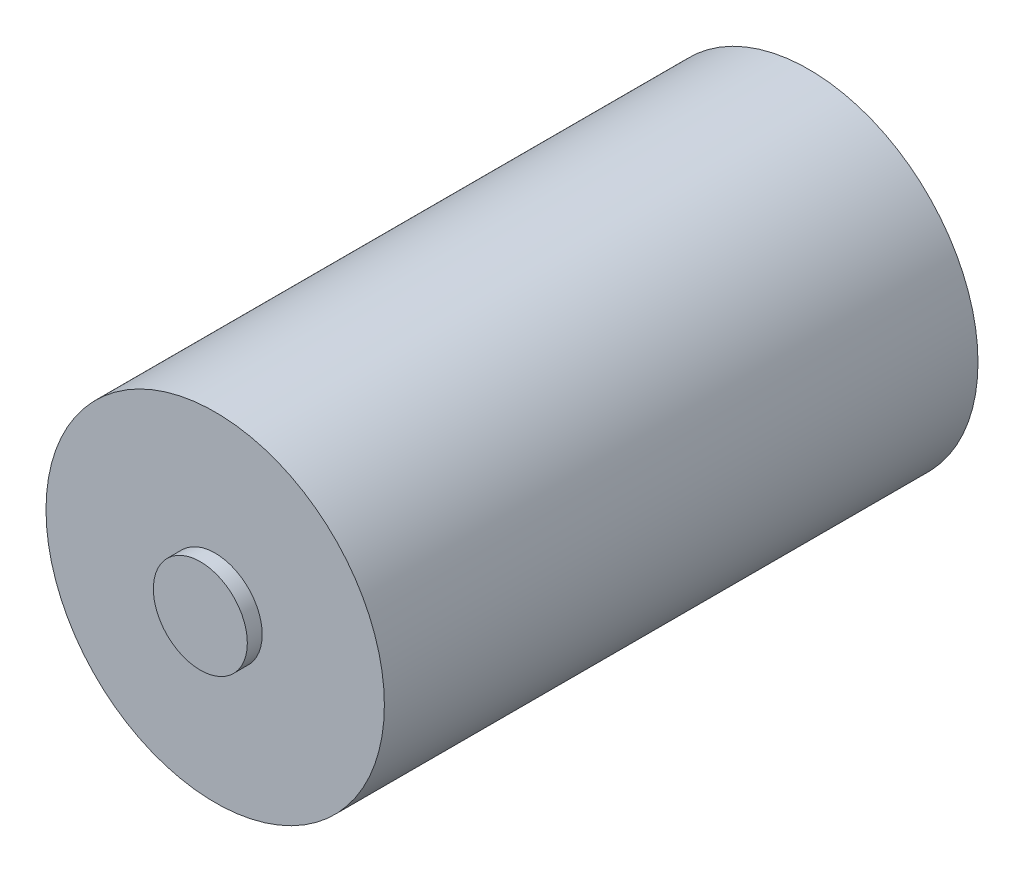
ISO-10303-21;
HEADER;
FILE_DESCRIPTION(('STEP AP214'),'2;1');
FILE_NAME('part.step','',(''),(''),'','','');
FILE_SCHEMA(('AUTOMOTIVE_DESIGN { 1 0 10303 214 1 1 1 1 }'));
ENDSEC;
DATA;
#1=APPLICATION_CONTEXT('core data for automotive mechanical design processes');
#2=APPLICATION_PROTOCOL_DEFINITION('international standard','automotive_design',2000,#1);
#3=PRODUCT_CONTEXT('',#1,'mechanical');
#4=PRODUCT('Part','Part','',(#3));
#5=PRODUCT_RELATED_PRODUCT_CATEGORY('part','',(#4));
#6=PRODUCT_DEFINITION_FORMATION('','',#4);
#7=PRODUCT_DEFINITION_CONTEXT('part definition',#1,'design');
#8=PRODUCT_DEFINITION('design','',#6,#7);
#9=PRODUCT_DEFINITION_SHAPE('','',#8);
#10=(LENGTH_UNIT() NAMED_UNIT(*) SI_UNIT(.MILLI.,.METRE.));
#11=(NAMED_UNIT(*) PLANE_ANGLE_UNIT() SI_UNIT($,.RADIAN.));
#12=(NAMED_UNIT(*) SI_UNIT($,.STERADIAN.) SOLID_ANGLE_UNIT());
#13=UNCERTAINTY_MEASURE_WITH_UNIT(LENGTH_MEASURE(1.E-05),#10,'distance_accuracy_value','');
#14=(GEOMETRIC_REPRESENTATION_CONTEXT(3) GLOBAL_UNCERTAINTY_ASSIGNED_CONTEXT((#13)) GLOBAL_UNIT_ASSIGNED_CONTEXT((#10,
#11,#12)) REPRESENTATION_CONTEXT('',''));
#15=CARTESIAN_POINT('',(0.,0.,0.));
#16=DIRECTION('',(0.,0.,1.));
#17=DIRECTION('',(1.,0.,0.));
#18=AXIS2_PLACEMENT_3D('',#15,#16,#17);
#19=CARTESIAN_POINT('',(0.,0.,61.5));
#20=DIRECTION('',(0.,0.,-1.));
#21=DIRECTION('',(-1.,0.,0.));
#22=AXIS2_PLACEMENT_3D('',#19,#20,#21);
#23=CYLINDRICAL_SURFACE('',#22,17.1);
#24=CARTESIAN_POINT('',(0.,0.,57.2158222345027));
#25=DIRECTION('',(0.,0.,-1.));
#26=DIRECTION('',(0.141506846168422,-0.98993727704712,0.));
#27=AXIS2_PLACEMENT_3D('',#24,#25,#26);
#28=CIRCLE('',#27,17.1);
#29=CARTESIAN_POINT('',(3.80024512058272,-16.6723764659837,57.2158222345027));
#30=VERTEX_POINT('',#29);
#31=CARTESIAN_POINT('',(2.41976706948002,-16.9279274375058,57.2158222345027));
#32=VERTEX_POINT('',#31);
#33=EDGE_CURVE('E177',#30,#32,#28,.T.);
#34=ORIENTED_EDGE('',*,*,#33,.F.);
#35=DIRECTION('',(0.,0.,1.));
#36=VECTOR('',#35,1.);
#37=CARTESIAN_POINT('',(3.80024512058272,-16.6723764659837,57.2158222345027));
#38=LINE('',#37,#36);
#39=CARTESIAN_POINT('',(3.80024512058272,-16.6723764659837,58.6201491575797));
#40=VERTEX_POINT('',#39);
#41=EDGE_CURVE('E213',#30,#40,#38,.T.);
#42=ORIENTED_EDGE('',*,*,#41,.T.);
#43=CARTESIAN_POINT('',(0.,0.,58.6201491575797));
#44=DIRECTION('',(0.,0.,-1.));
#45=DIRECTION('',(0.222236556759223,-0.974992775788521,0.));
#46=AXIS2_PLACEMENT_3D('',#43,#44,#45);
#47=CIRCLE('',#46,17.1);
#48=CARTESIAN_POINT('',(4.2157304152835,-16.5721940932893,58.6201491575797));
#49=VERTEX_POINT('',#48);
#50=EDGE_CURVE('E209',#49,#40,#47,.T.);
#51=ORIENTED_EDGE('',*,*,#50,.F.);
#52=DIRECTION('',(0.,0.,-1.));
#53=VECTOR('',#52,1.);
#54=CARTESIAN_POINT('',(4.2157304152835,-16.5721940932893,58.6201491575797));
#55=LINE('',#54,#53);
#56=CARTESIAN_POINT('',(4.2157304152835,-16.5721940932893,57.2158222345027));
#57=VERTEX_POINT('',#56);
#58=EDGE_CURVE('E206',#49,#57,#55,.T.);
#59=ORIENTED_EDGE('',*,*,#58,.T.);
#60=CARTESIAN_POINT('',(0.,0.,57.2158222345027));
#61=DIRECTION('',(0.,0.,-1.));
#62=DIRECTION('',(0.24653394241424,-0.9691341575023,0.));
#63=AXIS2_PLACEMENT_3D('',#60,#61,#62);
#64=CIRCLE('',#63,17.1);
#65=CARTESIAN_POINT('',(5.56097395635696,-16.1705154109793,57.2158222345027));
#66=VERTEX_POINT('',#65);
#67=EDGE_CURVE('E202',#66,#57,#64,.T.);
#68=ORIENTED_EDGE('',*,*,#67,.F.);
#69=DIRECTION('',(0.,0.,-1.));
#70=VECTOR('',#69,1.);
#71=CARTESIAN_POINT('',(5.56097395635696,-16.1705154109793,57.2158222345027));
#72=LINE('',#71,#70);
#73=CARTESIAN_POINT('',(5.56097395635696,-16.1705154109793,56.7884183883489));
#74=VERTEX_POINT('',#73);
#75=EDGE_CURVE('E199',#66,#74,#72,.T.);
#76=ORIENTED_EDGE('',*,*,#75,.T.);
#77=CARTESIAN_POINT('',(0.,0.,56.7884183883489));
#78=DIRECTION('',(0.,0.,-1.));
#79=DIRECTION('',(0.24653394241424,-0.9691341575023,0.));
#80=AXIS2_PLACEMENT_3D('',#77,#78,#79);
#81=CIRCLE('',#80,17.1);
#82=CARTESIAN_POINT('',(4.2157304152835,-16.5721940932893,56.7884183883489));
#83=VERTEX_POINT('',#82);
#84=EDGE_CURVE('E196',#74,#83,#81,.T.);
#85=ORIENTED_EDGE('',*,*,#84,.T.);
#86=DIRECTION('',(0.,0.,-1.));
#87=VECTOR('',#86,1.);
#88=CARTESIAN_POINT('',(4.2157304152835,-16.5721940932893,56.7884183883489));
#89=LINE('',#88,#87);
#90=CARTESIAN_POINT('',(4.2157304152835,-16.5721940932893,55.384091465272));
#91=VERTEX_POINT('',#90);
#92=EDGE_CURVE('E193',#83,#91,#89,.T.);
#93=ORIENTED_EDGE('',*,*,#92,.T.);
#94=CARTESIAN_POINT('',(0.,0.,55.384091465272));
#95=DIRECTION('',(0.,0.,-1.));
#96=DIRECTION('',(0.222236556759223,-0.974992775788521,0.));
#97=AXIS2_PLACEMENT_3D('',#94,#95,#96);
#98=CIRCLE('',#97,17.1);
#99=CARTESIAN_POINT('',(3.80024512058272,-16.6723764659837,55.384091465272));
#100=VERTEX_POINT('',#99);
#101=EDGE_CURVE('E190',#91,#100,#98,.T.);
#102=ORIENTED_EDGE('',*,*,#101,.T.);
#103=DIRECTION('',(0.,0.,1.));
#104=VECTOR('',#103,1.);
#105=CARTESIAN_POINT('',(3.80024512058272,-16.6723764659837,55.384091465272));
#106=LINE('',#105,#104);
#107=CARTESIAN_POINT('',(3.80024512058273,-16.6723764659837,56.7884183883489));
#108=VERTEX_POINT('',#107);
#109=EDGE_CURVE('E171',#100,#108,#106,.T.);
#110=ORIENTED_EDGE('',*,*,#109,.T.);
#111=CARTESIAN_POINT('',(0.,0.,56.7884183883489));
#112=DIRECTION('',(0.,0.,-1.));
#113=DIRECTION('',(0.141506846168422,-0.98993727704712,0.));
#114=AXIS2_PLACEMENT_3D('',#111,#112,#113);
#115=CIRCLE('',#114,17.1);
#116=CARTESIAN_POINT('',(2.41976706948002,-16.9279274375058,56.7884183883489));
#117=VERTEX_POINT('',#116);
#118=EDGE_CURVE('E166',#108,#117,#115,.T.);
#119=ORIENTED_EDGE('',*,*,#118,.T.);
#120=DIRECTION('',(0.,0.,1.));
#121=VECTOR('',#120,1.);
#122=CARTESIAN_POINT('',(2.41976706948002,-16.9279274375058,56.7884183883489));
#123=LINE('',#122,#121);
#124=EDGE_CURVE('E169',#117,#32,#123,.T.);
#125=ORIENTED_EDGE('',*,*,#124,.T.);
#126=EDGE_LOOP('',(#34,#42,#51,#59,#68,#76,#85,#93,#102,#110,#119,#125));
#127=FACE_BOUND('',#126,.T.);
#128=CARTESIAN_POINT('',(0.,0.,0.));
#129=DIRECTION('',(0.,0.,1.));
#130=DIRECTION('',(1.,0.,0.));
#131=AXIS2_PLACEMENT_3D('',#128,#129,#130);
#132=CIRCLE('',#131,17.1);
#133=CARTESIAN_POINT('',(17.1,0.,0.));
#134=VERTEX_POINT('',#133);
#135=EDGE_CURVE('E179',#134,#134,#132,.T.);
#136=ORIENTED_EDGE('',*,*,#135,.T.);
#137=EDGE_LOOP('',(#136));
#138=FACE_BOUND('',#137,.T.);
#139=CARTESIAN_POINT('',(0.,0.,60.));
#140=DIRECTION('',(0.,0.,1.));
#141=DIRECTION('',(1.,0.,0.));
#142=AXIS2_PLACEMENT_3D('',#139,#140,#141);
#143=CIRCLE('',#142,17.1);
#144=CARTESIAN_POINT('',(17.1,0.,60.));
#145=VERTEX_POINT('',#144);
#146=EDGE_CURVE('E184',#145,#145,#143,.T.);
#147=ORIENTED_EDGE('',*,*,#146,.F.);
#148=EDGE_LOOP('',(#147));
#149=FACE_BOUND('',#148,.T.);
#150=CARTESIAN_POINT('',(0.,0.,3.94677194649577));
#151=DIRECTION('',(0.,0.,-1.));
#152=DIRECTION('',(0.130894845282502,-0.991396257547137,0.));
#153=AXIS2_PLACEMENT_3D('',#150,#151,#152);
#154=CIRCLE('',#153,17.1);
#155=CARTESIAN_POINT('',(4.0379726613988,-16.6164008372991,3.94677194649577));
#156=VERTEX_POINT('',#155);
#157=CARTESIAN_POINT('',(2.23830185433078,-16.952876004056,3.94677194649577));
#158=VERTEX_POINT('',#157);
#159=EDGE_CURVE('E218',#156,#158,#154,.T.);
#160=ORIENTED_EDGE('',*,*,#159,.T.);
#161=DIRECTION('',(0.,0.,1.));
#162=VECTOR('',#161,1.);
#163=CARTESIAN_POINT('',(2.23830185433078,-16.952876004056,3.94677194649577));
#164=LINE('',#163,#162);
#165=CARTESIAN_POINT('',(2.23830185433078,-16.952876004056,4.43523348495731));
#166=VERTEX_POINT('',#165);
#167=EDGE_CURVE('E13',#158,#166,#164,.T.);
#168=ORIENTED_EDGE('',*,*,#167,.T.);
#169=CARTESIAN_POINT('',(0.,0.,4.43523348495731));
#170=DIRECTION('',(0.,0.,-1.));
#171=DIRECTION('',(0.130894845282502,-0.991396257547137,0.));
#172=AXIS2_PLACEMENT_3D('',#169,#170,#171);
#173=CIRCLE('',#172,17.1);
#174=CARTESIAN_POINT('',(4.0379726613988,-16.6164008372991,4.43523348495731));
#175=VERTEX_POINT('',#174);
#176=EDGE_CURVE('E114',#175,#166,#173,.T.);
#177=ORIENTED_EDGE('',*,*,#176,.F.);
#178=DIRECTION('',(0.,0.,-1.));
#179=VECTOR('',#178,1.);
#180=CARTESIAN_POINT('',(4.0379726613988,-16.6164008372991,4.43523348495731));
#181=LINE('',#180,#179);
#182=EDGE_CURVE('E221',#175,#156,#181,.T.);
#183=ORIENTED_EDGE('',*,*,#182,.T.);
#184=EDGE_LOOP('',(#160,#168,#177,#183));
#185=FACE_BOUND('',#184,.T.);
#186=ADVANCED_FACE('F105',(#127,#138,#149,#185),#23,.T.);
#187=ORIENTED_EDGE('',*,*,#41,.F.);
#188=ORIENTED_EDGE('',*,*,#33,.T.);
#189=ORIENTED_EDGE('',*,*,#124,.F.);
#190=ORIENTED_EDGE('',*,*,#118,.F.);
#191=ORIENTED_EDGE('',*,*,#109,.F.);
#192=ORIENTED_EDGE('',*,*,#101,.F.);
#193=ORIENTED_EDGE('',*,*,#92,.F.);
#194=ORIENTED_EDGE('',*,*,#84,.F.);
#195=ORIENTED_EDGE('',*,*,#75,.F.);
#196=ORIENTED_EDGE('',*,*,#67,.T.);
#197=ORIENTED_EDGE('',*,*,#58,.F.);
#198=ORIENTED_EDGE('',*,*,#50,.T.);
#199=EDGE_LOOP('',(#187,#188,#189,#190,#191,#192,#193,#194,#195,#196,#197,#198));
#200=FACE_BOUND('',#199,.T.);
#201=ADVANCED_FACE('F176',(#200),#23,.T.);
#202=ORIENTED_EDGE('',*,*,#167,.F.);
#203=ORIENTED_EDGE('',*,*,#159,.F.);
#204=ORIENTED_EDGE('',*,*,#182,.F.);
#205=ORIENTED_EDGE('',*,*,#176,.T.);
#206=EDGE_LOOP('',(#202,#203,#204,#205));
#207=FACE_BOUND('',#206,.T.);
#208=ADVANCED_FACE('F107',(#207),#23,.T.);
#209=CARTESIAN_POINT('',(0.,0.,0.));
#210=DIRECTION('',(0.,0.,1.));
#211=DIRECTION('',(1.,0.,0.));
#212=AXIS2_PLACEMENT_3D('',#209,#210,#211);
#213=PLANE('',#212);
#214=ORIENTED_EDGE('',*,*,#135,.F.);
#215=EDGE_LOOP('',(#214));
#216=FACE_BOUND('',#215,.T.);
#217=ADVANCED_FACE('F233',(#216),#213,.F.);
#218=CARTESIAN_POINT('',(0.,0.,60.));
#219=DIRECTION('',(0.,0.,1.));
#220=DIRECTION('',(1.,0.,0.));
#221=AXIS2_PLACEMENT_3D('',#218,#219,#220);
#222=PLANE('',#221);
#223=CARTESIAN_POINT('',(0.,0.,60.));
#224=DIRECTION('',(0.,0.,1.));
#225=DIRECTION('',(1.,0.,0.));
#226=AXIS2_PLACEMENT_3D('',#223,#224,#225);
#227=CIRCLE('',#226,4.75);
#228=CARTESIAN_POINT('',(4.75,0.,60.));
#229=VERTEX_POINT('',#228);
#230=EDGE_CURVE('E258',#229,#229,#227,.T.);
#231=ORIENTED_EDGE('',*,*,#230,.F.);
#232=EDGE_LOOP('',(#231));
#233=FACE_BOUND('',#232,.T.);
#234=ORIENTED_EDGE('',*,*,#146,.T.);
#235=EDGE_LOOP('',(#234));
#236=FACE_BOUND('',#235,.T.);
#237=ADVANCED_FACE('F237',(#233,#236),#222,.T.);
#238=CARTESIAN_POINT('',(0.,0.,60.));
#239=DIRECTION('',(0.,0.,1.));
#240=DIRECTION('',(1.,0.,0.));
#241=AXIS2_PLACEMENT_3D('',#238,#239,#240);
#242=CYLINDRICAL_SURFACE('',#241,4.75);
#243=ORIENTED_EDGE('',*,*,#230,.T.);
#244=EDGE_LOOP('',(#243));
#245=FACE_BOUND('',#244,.T.);
#246=CARTESIAN_POINT('',(0.,0.,61.5));
#247=DIRECTION('',(0.,0.,1.));
#248=DIRECTION('',(1.,0.,0.));
#249=AXIS2_PLACEMENT_3D('',#246,#247,#248);
#250=CIRCLE('',#249,4.75);
#251=CARTESIAN_POINT('',(4.75,0.,61.5));
#252=VERTEX_POINT('',#251);
#253=EDGE_CURVE('E261',#252,#252,#250,.T.);
#254=ORIENTED_EDGE('',*,*,#253,.F.);
#255=EDGE_LOOP('',(#254));
#256=FACE_BOUND('',#255,.T.);
#257=ADVANCED_FACE('F242',(#245,#256),#242,.T.);
#258=CARTESIAN_POINT('',(0.,0.,61.5));
#259=DIRECTION('',(0.,0.,1.));
#260=DIRECTION('',(1.,0.,0.));
#261=AXIS2_PLACEMENT_3D('',#258,#259,#260);
#262=PLANE('',#261);
#263=ORIENTED_EDGE('',*,*,#253,.T.);
#264=EDGE_LOOP('',(#263));
#265=FACE_BOUND('',#264,.T.);
#266=ADVANCED_FACE('F247',(#265),#262,.T.);
#267=CLOSED_SHELL('',(#186,#201,#208,#217,#237,#257,#266));
#268=MANIFOLD_SOLID_BREP('B2',#267);
#269=ADVANCED_BREP_SHAPE_REPRESENTATION('',(#18,#268),#14);
#270=SHAPE_DEFINITION_REPRESENTATION(#9,#269);
ENDSEC;
END-ISO-10303-21;
